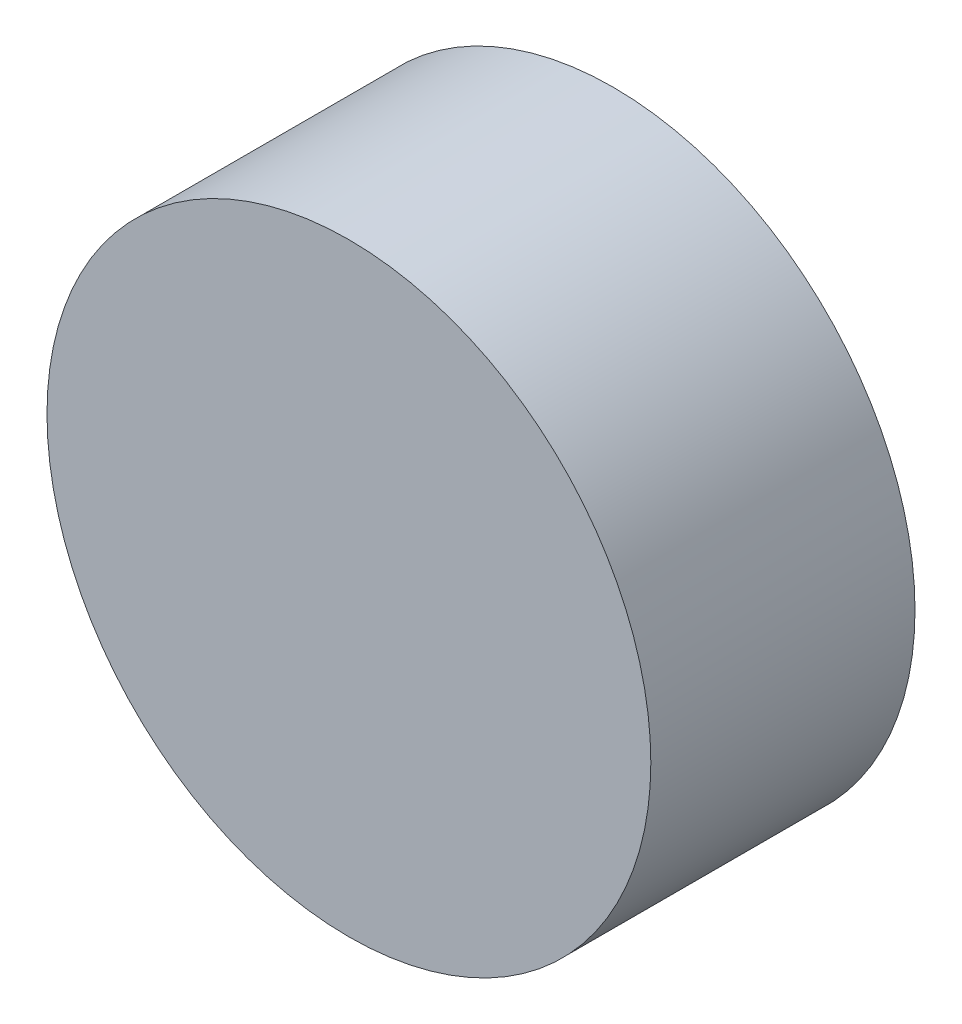
ISO-10303-21;
HEADER;
FILE_DESCRIPTION(('STEP AP214'),'2;1');
FILE_NAME('part.step','',(''),(''),'','','');
FILE_SCHEMA(('AUTOMOTIVE_DESIGN { 1 0 10303 214 1 1 1 1 }'));
ENDSEC;
DATA;
#1=APPLICATION_CONTEXT('core data for automotive mechanical design processes');
#2=APPLICATION_PROTOCOL_DEFINITION('international standard','automotive_design',2000,#1);
#3=PRODUCT_CONTEXT('',#1,'mechanical');
#4=PRODUCT('Part','Part','',(#3));
#5=PRODUCT_RELATED_PRODUCT_CATEGORY('part','',(#4));
#6=PRODUCT_DEFINITION_FORMATION('','',#4);
#7=PRODUCT_DEFINITION_CONTEXT('part definition',#1,'design');
#8=PRODUCT_DEFINITION('design','',#6,#7);
#9=PRODUCT_DEFINITION_SHAPE('','',#8);
#10=(LENGTH_UNIT() NAMED_UNIT(*) SI_UNIT(.MILLI.,.METRE.));
#11=(NAMED_UNIT(*) PLANE_ANGLE_UNIT() SI_UNIT($,.RADIAN.));
#12=(NAMED_UNIT(*) SI_UNIT($,.STERADIAN.) SOLID_ANGLE_UNIT());
#13=UNCERTAINTY_MEASURE_WITH_UNIT(LENGTH_MEASURE(1.E-05),#10,'distance_accuracy_value','');
#14=(GEOMETRIC_REPRESENTATION_CONTEXT(3) GLOBAL_UNCERTAINTY_ASSIGNED_CONTEXT((#13)) GLOBAL_UNIT_ASSIGNED_CONTEXT((#10,
#11,#12)) REPRESENTATION_CONTEXT('',''));
#15=CARTESIAN_POINT('',(0.,0.,0.));
#16=DIRECTION('',(0.,0.,1.));
#17=DIRECTION('',(1.,0.,0.));
#18=AXIS2_PLACEMENT_3D('',#15,#16,#17);
#19=CARTESIAN_POINT('',(0.,0.,14.));
#20=DIRECTION('',(0.,0.,-1.));
#21=DIRECTION('',(-1.,0.,0.));
#22=AXIS2_PLACEMENT_3D('',#19,#20,#21);
#23=CYLINDRICAL_SURFACE('',#22,16.);
#24=CARTESIAN_POINT('',(0.,0.,14.));
#25=DIRECTION('',(0.,0.,1.));
#26=DIRECTION('',(1.,0.,0.));
#27=AXIS2_PLACEMENT_3D('',#24,#25,#26);
#28=CIRCLE('',#27,16.);
#29=CARTESIAN_POINT('',(16.,0.,14.));
#30=VERTEX_POINT('',#29);
#31=EDGE_CURVE('E10',#30,#30,#28,.T.);
#32=ORIENTED_EDGE('',*,*,#31,.F.);
#33=EDGE_LOOP('',(#32));
#34=FACE_BOUND('',#33,.T.);
#35=CARTESIAN_POINT('',(0.,0.,0.));
#36=DIRECTION('',(0.,0.,1.));
#37=DIRECTION('',(1.,0.,0.));
#38=AXIS2_PLACEMENT_3D('',#35,#36,#37);
#39=CIRCLE('',#38,16.);
#40=CARTESIAN_POINT('',(16.,0.,0.));
#41=VERTEX_POINT('',#40);
#42=EDGE_CURVE('E45',#41,#41,#39,.T.);
#43=ORIENTED_EDGE('',*,*,#42,.T.);
#44=EDGE_LOOP('',(#43));
#45=FACE_BOUND('',#44,.T.);
#46=ADVANCED_FACE('F39',(#34,#45),#23,.T.);
#47=CARTESIAN_POINT('',(0.,0.,14.));
#48=DIRECTION('',(0.,0.,1.));
#49=DIRECTION('',(1.,0.,0.));
#50=AXIS2_PLACEMENT_3D('',#47,#48,#49);
#51=PLANE('',#50);
#52=ORIENTED_EDGE('',*,*,#31,.T.);
#53=EDGE_LOOP('',(#52));
#54=FACE_BOUND('',#53,.T.);
#55=ADVANCED_FACE('F53',(#54),#51,.T.);
#56=CARTESIAN_POINT('',(0.,0.,0.));
#57=DIRECTION('',(0.,0.,1.));
#58=DIRECTION('',(1.,0.,0.));
#59=AXIS2_PLACEMENT_3D('',#56,#57,#58);
#60=PLANE('',#59);
#61=ORIENTED_EDGE('',*,*,#42,.F.);
#62=EDGE_LOOP('',(#61));
#63=FACE_BOUND('',#62,.T.);
#64=ADVANCED_FACE('F55',(#63),#60,.F.);
#65=CLOSED_SHELL('',(#46,#55,#64));
#66=MANIFOLD_SOLID_BREP('B2',#65);
#67=ADVANCED_BREP_SHAPE_REPRESENTATION('',(#18,#66),#14);
#68=SHAPE_DEFINITION_REPRESENTATION(#9,#67);
ENDSEC;
END-ISO-10303-21;
